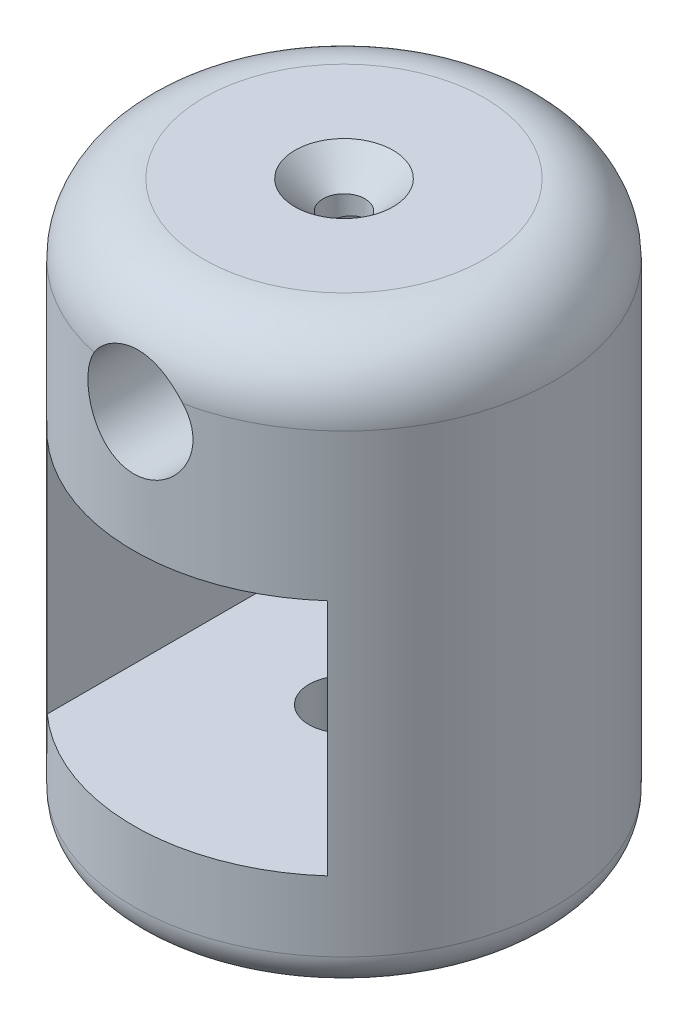
ISO-10303-21;
HEADER;
FILE_DESCRIPTION(('STEP AP214'),'2;1');
FILE_NAME('part.step','',(''),(''),'','','');
FILE_SCHEMA(('AUTOMOTIVE_DESIGN { 1 0 10303 214 1 1 1 1 }'));
ENDSEC;
DATA;
#1=APPLICATION_CONTEXT('core data for automotive mechanical design processes');
#2=APPLICATION_PROTOCOL_DEFINITION('international standard','automotive_design',2000,#1);
#3=PRODUCT_CONTEXT('',#1,'mechanical');
#4=PRODUCT('Part','Part','',(#3));
#5=PRODUCT_RELATED_PRODUCT_CATEGORY('part','',(#4));
#6=PRODUCT_DEFINITION_FORMATION('','',#4);
#7=PRODUCT_DEFINITION_CONTEXT('part definition',#1,'design');
#8=PRODUCT_DEFINITION('design','',#6,#7);
#9=PRODUCT_DEFINITION_SHAPE('','',#8);
#10=(LENGTH_UNIT() NAMED_UNIT(*) SI_UNIT(.MILLI.,.METRE.));
#11=(NAMED_UNIT(*) PLANE_ANGLE_UNIT() SI_UNIT($,.RADIAN.));
#12=(NAMED_UNIT(*) SI_UNIT($,.STERADIAN.) SOLID_ANGLE_UNIT());
#13=UNCERTAINTY_MEASURE_WITH_UNIT(LENGTH_MEASURE(1.E-05),#10,'distance_accuracy_value','');
#14=(GEOMETRIC_REPRESENTATION_CONTEXT(3) GLOBAL_UNCERTAINTY_ASSIGNED_CONTEXT((#13)) GLOBAL_UNIT_ASSIGNED_CONTEXT((#10,
#11,#12)) REPRESENTATION_CONTEXT('',''));
#15=CARTESIAN_POINT('',(0.,0.,0.));
#16=DIRECTION('',(0.,0.,1.));
#17=DIRECTION('',(1.,0.,0.));
#18=AXIS2_PLACEMENT_3D('',#15,#16,#17);
#19=CARTESIAN_POINT('',(0.,40.,0.));
#20=DIRECTION('',(0.,-1.,0.));
#21=DIRECTION('',(0.,0.,-1.));
#22=AXIS2_PLACEMENT_3D('',#19,#20,#21);
#23=CYLINDRICAL_SURFACE('',#22,15.);
#24=CARTESIAN_POINT('',(0.,2.5,0.));
#25=DIRECTION('',(0.,1.,0.));
#26=DIRECTION('',(0.,0.,1.));
#27=AXIS2_PLACEMENT_3D('',#24,#25,#26);
#28=CIRCLE('',#27,15.);
#29=CARTESIAN_POINT('',(0.,2.5,15.));
#30=VERTEX_POINT('',#29);
#31=EDGE_CURVE('E56',#30,#30,#28,.T.);
#32=ORIENTED_EDGE('',*,*,#31,.T.);
#33=EDGE_LOOP('',(#32));
#34=FACE_BOUND('',#33,.T.);
#35=DIRECTION('',(0.,-1.,0.));
#36=VECTOR('',#35,1.);
#37=CARTESIAN_POINT('',(-10.,40.,-11.180339887499));
#38=LINE('',#37,#36);
#39=CARTESIAN_POINT('',(-10.,24.5,-11.180339887499));
#40=VERTEX_POINT('',#39);
#41=CARTESIAN_POINT('',(-10.,7.5,-11.180339887499));
#42=VERTEX_POINT('',#41);
#43=EDGE_CURVE('E101',#40,#42,#38,.T.);
#44=ORIENTED_EDGE('',*,*,#43,.T.);
#45=CARTESIAN_POINT('',(0.,7.5,0.));
#46=DIRECTION('',(0.,-1.,0.));
#47=DIRECTION('',(0.,0.,-1.));
#48=AXIS2_PLACEMENT_3D('',#45,#46,#47);
#49=CIRCLE('',#48,15.);
#50=CARTESIAN_POINT('',(10.,7.5,-11.180339887499));
#51=VERTEX_POINT('',#50);
#52=EDGE_CURVE('E132',#42,#51,#49,.T.);
#53=ORIENTED_EDGE('',*,*,#52,.T.);
#54=DIRECTION('',(0.,-1.,0.));
#55=VECTOR('',#54,1.);
#56=CARTESIAN_POINT('',(10.,40.,-11.180339887499));
#57=LINE('',#56,#55);
#58=CARTESIAN_POINT('',(10.,24.5,-11.1803398874989));
#59=VERTEX_POINT('',#58);
#60=EDGE_CURVE('E128',#51,#59,#57,.F.);
#61=ORIENTED_EDGE('',*,*,#60,.T.);
#62=CARTESIAN_POINT('',(0.,24.5,0.));
#63=DIRECTION('',(0.,1.,0.));
#64=DIRECTION('',(0.,0.,1.));
#65=AXIS2_PLACEMENT_3D('',#62,#63,#64);
#66=CIRCLE('',#65,15.);
#67=EDGE_CURVE('E113',#59,#40,#66,.T.);
#68=ORIENTED_EDGE('',*,*,#67,.T.);
#69=EDGE_LOOP('',(#44,#53,#61,#68));
#70=FACE_BOUND('',#69,.T.);
#71=DIRECTION('',(0.,-1.,0.));
#72=VECTOR('',#71,1.);
#73=CARTESIAN_POINT('',(10.,40.,11.180339887499));
#74=LINE('',#73,#72);
#75=CARTESIAN_POINT('',(10.,24.5,11.1803398874989));
#76=VERTEX_POINT('',#75);
#77=CARTESIAN_POINT('',(10.,7.5,11.180339887499));
#78=VERTEX_POINT('',#77);
#79=EDGE_CURVE('E137',#76,#78,#74,.T.);
#80=ORIENTED_EDGE('',*,*,#79,.T.);
#81=CARTESIAN_POINT('',(-10.,7.5,11.180339887499));
#82=VERTEX_POINT('',#81);
#83=EDGE_CURVE('E114',#78,#82,#49,.T.);
#84=ORIENTED_EDGE('',*,*,#83,.T.);
#85=DIRECTION('',(0.,-1.,0.));
#86=VECTOR('',#85,1.);
#87=CARTESIAN_POINT('',(-10.,40.,11.180339887499));
#88=LINE('',#87,#86);
#89=CARTESIAN_POINT('',(-10.,24.5,11.180339887499));
#90=VERTEX_POINT('',#89);
#91=EDGE_CURVE('E138',#82,#90,#88,.F.);
#92=ORIENTED_EDGE('',*,*,#91,.T.);
#93=EDGE_CURVE('E121',#90,#76,#66,.T.);
#94=ORIENTED_EDGE('',*,*,#93,.T.);
#95=EDGE_LOOP('',(#80,#84,#92,#94));
#96=FACE_BOUND('',#95,.T.);
#97=CARTESIAN_POINT('',(0.,36.75,-15.));
#98=CARTESIAN_POINT('',(0.207190221674328,36.7499941856546,-14.9999964967003));
#99=CARTESIAN_POINT('',(0.414445394576909,36.7327711230655,-14.9956644532957));
#100=CARTESIAN_POINT('',(0.823015809426332,36.6644371217325,-14.9788028457474));
#101=CARTESIAN_POINT('',(1.02432761717685,36.6133069761554,-14.9662686354994));
#102=CARTESIAN_POINT('',(1.41505218045644,36.4789018663448,-14.9343906583008));
#103=CARTESIAN_POINT('',(1.60447890857501,36.3956655032118,-14.9150550710515));
#104=CARTESIAN_POINT('',(1.96668032976107,36.1995465248879,-14.8716335951905));
#105=CARTESIAN_POINT('',(2.13945446087191,36.0866629097026,-14.8475475463539));
#106=CARTESIAN_POINT('',(2.46700481825229,35.8319980258646,-14.7966853397923));
#107=CARTESIAN_POINT('',(2.62138922515264,35.6897210626023,-14.7698676787032));
#108=CARTESIAN_POINT('',(2.9043723180083,35.3813694877274,-14.7168405029484));
#109=CARTESIAN_POINT('',(3.03296809237298,35.2152921926327,-14.6906310572467));
#110=CARTESIAN_POINT('',(3.26256635699744,34.8610119331575,-14.6413693924542));
#111=CARTESIAN_POINT('',(3.36313053981285,34.6725169229782,-14.6183698616203));
#112=CARTESIAN_POINT('',(3.53099227137686,34.2806289708499,-14.5787373704504));
#113=CARTESIAN_POINT('',(3.59829513860035,34.07723841667,-14.5621033923605));
#114=CARTESIAN_POINT('',(3.69638709201191,33.6656412544959,-14.5375119174081));
#115=CARTESIAN_POINT('',(3.72788067083013,33.457612759905,-14.5293872749253));
#116=CARTESIAN_POINT('',(3.75565443766602,33.0390785775016,-14.5222340614898));
#117=CARTESIAN_POINT('',(3.75194035454528,32.8285732982697,-14.5232040106982));
#118=CARTESIAN_POINT('',(3.70996631159927,32.4164604806366,-14.5339801379204));
#119=CARTESIAN_POINT('',(3.67254585047659,32.2147609463367,-14.5435715751823));
#120=CARTESIAN_POINT('',(3.56556046725749,31.8205973727224,-14.5701677417767));
#121=CARTESIAN_POINT('',(3.49599325517349,31.6281339924277,-14.587172999231));
#122=CARTESIAN_POINT('',(3.32597369484297,31.2556549593697,-14.6268778476415));
#123=CARTESIAN_POINT('',(3.2252166680823,31.0757845705261,-14.6496331867454));
#124=CARTESIAN_POINT('',(2.99589069003737,30.735203225608,-14.6982427711498));
#125=CARTESIAN_POINT('',(2.8673168720221,30.5744956298319,-14.7240975583657));
#126=CARTESIAN_POINT('',(2.58165856170305,30.271990960764,-14.7768970134973));
#127=CARTESIAN_POINT('',(2.42386564541465,30.1308637748466,-14.80385173695));
#128=CARTESIAN_POINT('',(2.08652979375925,29.8769468938402,-14.8551491394689));
#129=CARTESIAN_POINT('',(1.90698619426986,29.7641580643411,-14.8794917387352));
#130=CARTESIAN_POINT('',(1.53028972170348,29.569873534439,-14.9229433023548));
#131=CARTESIAN_POINT('',(1.33307848302156,29.4884866493639,-14.9420340031932));
#132=CARTESIAN_POINT('',(0.927190020357209,29.3602067357261,-14.9726979247854));
#133=CARTESIAN_POINT('',(0.718514997876213,29.3133071089547,-14.984272583482));
#134=CARTESIAN_POINT('',(0.301349925975069,29.2563560861029,-14.9983874817844));
#135=CARTESIAN_POINT('',(0.0929917999705268,29.2453924348117,-15.0011513377069));
#136=CARTESIAN_POINT('',(-0.322582187003769,29.2581225051387,-14.9979701203613));
#137=CARTESIAN_POINT('',(-0.529798149111488,29.2818131069978,-14.9920258310463));
#138=CARTESIAN_POINT('',(-0.934035671941224,29.3624272709784,-14.9722395281838));
#139=CARTESIAN_POINT('',(-1.13116279742187,29.4188531586924,-14.9585158546447));
#140=CARTESIAN_POINT('',(-1.51314323113129,29.5627677100711,-14.924717665854));
#141=CARTESIAN_POINT('',(-1.69799529758163,29.650259510783,-14.9046425092496));
#142=CARTESIAN_POINT('',(-2.05380783607457,29.8555903221867,-14.8598326981554));
#143=CARTESIAN_POINT('',(-2.22446360458941,29.9739402809914,-14.8350216841645));
#144=CARTESIAN_POINT('',(-2.54381653410828,30.2369747719929,-14.7836127296943));
#145=CARTESIAN_POINT('',(-2.69250989743313,30.3816638490441,-14.7570144813255));
#146=CARTESIAN_POINT('',(-2.9674764201812,30.6975049021093,-14.7042239239856));
#147=CARTESIAN_POINT('',(-3.09310966905271,30.869219257499,-14.678057604555));
#148=CARTESIAN_POINT('',(-3.31377689753411,31.2318315861713,-14.629821959558));
#149=CARTESIAN_POINT('',(-3.40881223540367,31.4227287074256,-14.6077524521502));
#150=CARTESIAN_POINT('',(-3.56487855151819,31.8172643060161,-14.570452367894));
#151=CARTESIAN_POINT('',(-3.62611099160838,32.0208190707826,-14.5551813805407));
#152=CARTESIAN_POINT('',(-3.71336414985792,32.4357740946363,-14.5331686006952));
#153=CARTESIAN_POINT('',(-3.73939256869197,32.6471726275465,-14.5264249429205));
#154=CARTESIAN_POINT('',(-3.75509647583946,33.0653025596698,-14.5223725301746));
#155=CARTESIAN_POINT('',(-3.74579474444336,33.2719935878592,-14.5247983170337));
#156=CARTESIAN_POINT('',(-3.6934431957724,33.6807597217042,-14.5381977237985));
#157=CARTESIAN_POINT('',(-3.6503940567158,33.8828349200396,-14.5491711719226));
#158=CARTESIAN_POINT('',(-3.53232829861052,34.27552114765,-14.5782815174391));
#159=CARTESIAN_POINT('',(-3.45750351170189,34.4661932630969,-14.5963753810072));
#160=CARTESIAN_POINT('',(-3.27816228401173,34.8324134567878,-14.6376938930212));
#161=CARTESIAN_POINT('',(-3.17364172508521,35.0079594329683,-14.6609192529923));
#162=CARTESIAN_POINT('',(-2.93466937159311,35.343886572504,-14.7106408566155));
#163=CARTESIAN_POINT('',(-2.79950790728071,35.5037526835596,-14.7372066208013));
#164=CARTESIAN_POINT('',(-2.50447342797427,35.7988676119888,-14.7902006811497));
#165=CARTESIAN_POINT('',(-2.34459455315285,35.9341105752825,-14.8166289431745));
#166=CARTESIAN_POINT('',(-2.0011689667565,36.1785282714114,-14.8669413911936));
#167=CARTESIAN_POINT('',(-1.81724605579097,36.2871865341789,-14.8907708341472));
#168=CARTESIAN_POINT('',(-1.43316514877618,36.4718686573514,-14.9326231243774));
#169=CARTESIAN_POINT('',(-1.23301890859185,36.5479159016213,-14.9506501299944));
#170=CARTESIAN_POINT('',(-0.861025633108679,36.6539295758241,-14.9762014891386));
#171=CARTESIAN_POINT('',(-0.690950427270171,36.6898781076336,-14.9850646263173));
#172=CARTESIAN_POINT('',(-0.347265178840707,36.7379148590549,-14.9969651307987));
#173=CARTESIAN_POINT('',(-0.17365540310654,36.7500048732633,-15.0000029362724));
#174=CARTESIAN_POINT('',(0.,36.75,-15.));
#175=B_SPLINE_CURVE_WITH_KNOTS('',3,(#97,#98,#99,#100,#101,#102,#103,#104,#105,#106,#107,#108,
#109,#110,#111,#112,#113,#114,#115,#116,#117,#118,#119,#120,#121,#122,#123,#124,#125,#126,#127,
#128,#129,#130,#131,#132,#133,#134,#135,#136,#137,#138,#139,#140,#141,#142,#143,#144,#145,#146,
#147,#148,#149,#150,#151,#152,#153,#154,#155,#156,#157,#158,#159,#160,#161,#162,#163,#164,#165,
#166,#167,#168,#169,#170,#171,#172,#173,#174),.UNSPECIFIED.,.T.,.F.,(4,2,2,2,2,2,2,2,2,2,2,2,2,
2,2,2,2,2,2,2,2,2,2,2,2,2,2,2,2,2,2,2,2,2,2,2,2,2,4),(0.,0.620934281179725,1.24222059440975,
1.86276225571526,2.48332485042332,3.11536088592847,3.74746823950155,4.38896618864518,
5.03036152923421,5.65890737752674,6.28735095290044,6.90056242525847,7.51381758673398,
8.13326319693,8.75281727098709,9.3900375243085,10.0272772390392,10.6667057253109,
11.3060118422991,11.9289577238149,12.5518475279016,13.165506862934,13.7792281831403,
14.4038396892168,15.0285590752835,15.6686127301949,16.3086379688207,16.9448063654645,
17.5808355814572,18.1985945101388,18.8163410240997,19.430410014185,20.0445642036213,
20.6747394104466,21.3050642444592,21.9468046376885,22.5880840957326,23.1085560737525,
23.6289889012748),.UNSPECIFIED.);
#176=CARTESIAN_POINT('',(3.17214438511239,35.,-14.6607469113957));
#177=VERTEX_POINT('',#176);
#178=CARTESIAN_POINT('',(-3.17214438511238,35.,-14.6607469113957));
#179=VERTEX_POINT('',#178);
#180=EDGE_CURVE('E142',#177,#179,#175,.T.);
#181=ORIENTED_EDGE('',*,*,#180,.F.);
#182=CARTESIAN_POINT('',(0.,35.,0.));
#183=DIRECTION('',(0.,1.,0.));
#184=DIRECTION('',(0.,0.,1.));
#185=AXIS2_PLACEMENT_3D('',#182,#183,#184);
#186=CIRCLE('',#185,15.);
#187=CARTESIAN_POINT('',(3.17214438511238,35.,14.6607469113957));
#188=VERTEX_POINT('',#187);
#189=EDGE_CURVE('E190',#177,#188,#186,.F.);
#190=ORIENTED_EDGE('',*,*,#189,.T.);
#191=CARTESIAN_POINT('',(-3.75,33.,14.5236875482778));
#192=CARTESIAN_POINT('',(-3.74999411788961,32.7929238736101,14.5236915013179));
#193=CARTESIAN_POINT('',(-3.73278936824648,32.5857826519822,14.528164590219));
#194=CARTESIAN_POINT('',(-3.66453468819569,32.1774486327397,14.5455279298885));
#195=CARTESIAN_POINT('',(-3.61346506011316,31.9762593682977,14.5584230793244));
#196=CARTESIAN_POINT('',(-3.47923679944806,31.5857946927192,14.5910808689423));
#197=CARTESIAN_POINT('',(-3.39611959178174,31.3965042669214,14.6108346403569));
#198=CARTESIAN_POINT('',(-3.20028171189208,31.0345337211902,14.6549728804314));
#199=CARTESIAN_POINT('',(-3.08755978284103,30.8618543068797,14.6793575456773));
#200=CARTESIAN_POINT('',(-2.83306264096782,30.5342075321067,14.7306107453344));
#201=CARTESIAN_POINT('',(-2.69075533155608,30.3796595994749,14.7575189643455));
#202=CARTESIAN_POINT('',(-2.382273096151,30.0963579084595,14.8104431327294));
#203=CARTESIAN_POINT('',(-2.21609594127046,29.9676065615674,14.8364589984958));
#204=CARTESIAN_POINT('',(-1.86171780161844,29.7378367985531,14.8851062328087));
#205=CARTESIAN_POINT('',(-1.67324186429268,29.6372304177578,14.9076853110089));
#206=CARTESIAN_POINT('',(-1.28139477643915,29.4692855337704,14.9464621788898));
#207=CARTESIAN_POINT('',(-1.07802582868791,29.4019421221267,14.9626609100152));
#208=CARTESIAN_POINT('',(-0.666538138131245,29.3037782481321,14.9865713827227));
#209=CARTESIAN_POINT('',(-0.458599079323466,29.2722455335101,14.9944484076647));
#210=CARTESIAN_POINT('',(-0.040243228894155,29.2443624310867,15.0014039116095));
#211=CARTESIAN_POINT('',(0.170173191807105,29.2480068416856,15.0004836914507));
#212=CARTESIAN_POINT('',(0.582570926896446,29.2898622753752,14.9900714243029));
#213=CARTESIAN_POINT('',(0.784635808503985,29.3273044875808,14.9807700351127));
#214=CARTESIAN_POINT('',(1.17951842780134,29.4344569050728,14.9548625478733));
#215=CARTESIAN_POINT('',(1.37233567263919,29.5041688280662,14.9382560609783));
#216=CARTESIAN_POINT('',(1.74527513813172,29.6745038560305,14.8993126455118));
#217=CARTESIAN_POINT('',(1.92526691162419,29.7754005669922,14.8769252954196));
#218=CARTESIAN_POINT('',(2.26603358377704,30.0050335186748,14.828848557151));
#219=CARTESIAN_POINT('',(2.4268051315714,30.1337746028425,14.8031585948106));
#220=CARTESIAN_POINT('',(2.72915263156781,30.4195631129719,14.7504557065189));
#221=CARTESIAN_POINT('',(2.87009129652906,30.5772823385155,14.7234257927984));
#222=CARTESIAN_POINT('',(3.12366140986426,30.9143999603165,14.671725652841));
#223=CARTESIAN_POINT('',(3.23629153518354,31.0937993692594,14.6470555369272));
#224=CARTESIAN_POINT('',(3.43045548382641,31.4704350512057,14.6028074521348));
#225=CARTESIAN_POINT('',(3.51183587610259,31.6677535953946,14.5832547546155));
#226=CARTESIAN_POINT('',(3.64007107734905,32.0738782020376,14.5517796010927));
#227=CARTESIAN_POINT('',(3.68693327456397,32.2826817959531,14.5398555123401));
#228=CARTESIAN_POINT('',(3.74374445800775,32.6999392523115,14.5253303404051));
#229=CARTESIAN_POINT('',(3.75463571088105,32.908256690016,14.5224913347325));
#230=CARTESIAN_POINT('',(3.74177548577037,33.3237329048734,14.5258101503919));
#231=CARTESIAN_POINT('',(3.71802719677408,33.530891786923,14.5319671435336));
#232=CARTESIAN_POINT('',(3.637388195908,33.934671397424,14.5523562297952));
#233=CARTESIAN_POINT('',(3.58104610242303,34.1314090898541,14.5664545536435));
#234=CARTESIAN_POINT('',(3.43742712250553,34.5126471867797,14.6010107739366));
#235=CARTESIAN_POINT('',(3.35014657156871,34.6971461385836,14.6214694236946));
#236=CARTESIAN_POINT('',(3.14515600190495,35.0526619168004,14.6669420564342));
#237=CARTESIAN_POINT('',(3.02688263075348,35.2233432600645,14.6920375291091));
#238=CARTESIAN_POINT('',(2.76397609850418,35.5427825442022,14.7437562460663));
#239=CARTESIAN_POINT('',(2.61933860552039,35.6915368749751,14.7703797409245));
#240=CARTESIAN_POINT('',(2.30348520369273,35.9667165638564,14.8229610454767));
#241=CARTESIAN_POINT('',(2.13169482199348,36.0924900938232,14.8488855309282));
#242=CARTESIAN_POINT('',(1.76888506010503,36.3134038004269,14.8964582492053));
#243=CARTESIAN_POINT('',(1.57786668359097,36.4085455749123,14.9181067050592));
#244=CARTESIAN_POINT('',(1.18334325649159,36.5646690517919,14.9545517360749));
#245=CARTESIAN_POINT('',(0.979940178854562,36.6258964265686,14.9693974503361));
#246=CARTESIAN_POINT('',(0.56531160119553,36.7131905019126,14.9907794009368));
#247=CARTESIAN_POINT('',(0.354087618904657,36.7392639881086,14.9973172409013));
#248=CARTESIAN_POINT('',(-0.0640632241624573,36.7551284609083,15.0012813528302));
#249=CARTESIAN_POINT('',(-0.270951851122577,36.7458814091078,14.9989492079996));
#250=CARTESIAN_POINT('',(-0.680128111555312,36.6935706476462,14.9859711171541));
#251=CARTESIAN_POINT('',(-0.88241588167848,36.6505079437006,14.9753254183938));
#252=CARTESIAN_POINT('',(-1.2756413836679,36.5323041758593,14.9469537320208));
#253=CARTESIAN_POINT('',(-1.46663435467823,36.4573370500711,14.9292661688397));
#254=CARTESIAN_POINT('',(-1.83343894890609,36.2776103286766,14.8886733342622));
#255=CARTESIAN_POINT('',(-2.00924865474612,36.1728469774857,14.8657674052034));
#256=CARTESIAN_POINT('',(-2.34525723158738,35.9335678725145,14.8165218630108));
#257=CARTESIAN_POINT('',(-2.50498120611875,35.7983994641106,14.7901131353124));
#258=CARTESIAN_POINT('',(-2.79980632602564,35.503414305085,14.7371493396446));
#259=CARTESIAN_POINT('',(-2.93490121903721,35.3435913145831,14.7105942362738));
#260=CARTESIAN_POINT('',(-3.17910759926936,35.0002446967895,14.6597803442063));
#261=CARTESIAN_POINT('',(-3.28768732281142,34.8163345373803,14.6355736377483));
#262=CARTESIAN_POINT('',(-3.47222586219551,34.4322919129694,14.592898331056));
#263=CARTESIAN_POINT('',(-3.54820841157057,34.2321713771481,14.5744255587455));
#264=CARTESIAN_POINT('',(-3.65408448214126,33.8603362056182,14.5481965781526));
#265=CARTESIAN_POINT('',(-3.68997438973829,33.690400633552,14.5390748626312));
#266=CARTESIAN_POINT('',(-3.73793359714413,33.3469917412587,14.5268189468483));
#267=CARTESIAN_POINT('',(-3.75000492889406,33.1735187240835,14.5236842358415));
#268=CARTESIAN_POINT('',(-3.75,33.,14.5236875482778));
#269=B_SPLINE_CURVE_WITH_KNOTS('',3,(#191,#192,#193,#194,#195,#196,#197,#198,#199,#200,#201,
#202,#203,#204,#205,#206,#207,#208,#209,#210,#211,#212,#213,#214,#215,#216,#217,#218,#219,#220,
#221,#222,#223,#224,#225,#226,#227,#228,#229,#230,#231,#232,#233,#234,#235,#236,#237,#238,#239,
#240,#241,#242,#243,#244,#245,#246,#247,#248,#249,#250,#251,#252,#253,#254,#255,#256,#257,#258,
#259,#260,#261,#262,#263,#264,#265,#266,#267,#268),.UNSPECIFIED.,.T.,.F.,(4,2,2,2,2,2,2,2,2,2,2,
2,2,2,2,2,2,2,2,2,2,2,2,2,2,2,2,2,2,2,2,2,2,2,2,2,2,2,4),(0.,0.620591162604203,1.241543612143,
1.86169609074903,2.48187490133218,3.11435931289464,3.746902822198,4.38827244596879,
5.02954739770638,5.65783126493019,6.2860222299903,6.9002739403342,7.51455835087179,
8.13439311381667,8.7543357820337,9.39105699857868,10.027807967997,10.6676464801437,
11.3073480019813,11.9301536215011,12.5529019078693,13.1654610752503,13.7780928214335,
14.4027426879996,15.0274952833879,15.667879964592,16.3082312359055,16.9438810922162,
17.5794082337478,18.1977516920241,18.8160767607669,19.4310731485079,20.0461470861833,
20.6759564488433,21.3059254735949,21.947647159405,22.5889008206633,23.1089674078239,
23.6289896266568),.UNSPECIFIED.);
#270=CARTESIAN_POINT('',(-3.17214438511246,35.,14.6607469113957));
#271=VERTEX_POINT('',#270);
#272=EDGE_CURVE('E145',#271,#188,#269,.T.);
#273=ORIENTED_EDGE('',*,*,#272,.F.);
#274=CARTESIAN_POINT('',(0.,35.,0.));
#275=DIRECTION('',(0.,1.,0.));
#276=DIRECTION('',(0.,0.,1.));
#277=AXIS2_PLACEMENT_3D('',#274,#275,#276);
#278=CIRCLE('',#277,15.);
#279=EDGE_CURVE('E63',#271,#179,#278,.F.);
#280=ORIENTED_EDGE('',*,*,#279,.T.);
#281=EDGE_LOOP('',(#181,#190,#273,#280));
#282=FACE_BOUND('',#281,.T.);
#283=ADVANCED_FACE('F47',(#34,#70,#96,#282),#23,.T.);
#284=CARTESIAN_POINT('',(0.,40.,0.));
#285=DIRECTION('',(0.,1.,0.));
#286=DIRECTION('',(0.,0.,1.));
#287=AXIS2_PLACEMENT_3D('',#284,#285,#286);
#288=PLANE('',#287);
#289=CARTESIAN_POINT('',(0.,40.,0.));
#290=DIRECTION('',(0.,1.,0.));
#291=DIRECTION('',(0.,0.,1.));
#292=AXIS2_PLACEMENT_3D('',#289,#290,#291);
#293=CIRCLE('',#292,3.50000000000004);
#294=CARTESIAN_POINT('',(0.,40.,3.50000000000004));
#295=VERTEX_POINT('',#294);
#296=EDGE_CURVE('E227',#295,#295,#293,.F.);
#297=ORIENTED_EDGE('',*,*,#296,.T.);
#298=EDGE_LOOP('',(#297));
#299=FACE_BOUND('',#298,.T.);
#300=CARTESIAN_POINT('',(0.,40.,0.));
#301=DIRECTION('',(0.,1.,0.));
#302=DIRECTION('',(0.,0.,1.));
#303=AXIS2_PLACEMENT_3D('',#300,#301,#302);
#304=CIRCLE('',#303,10.);
#305=CARTESIAN_POINT('',(0.,40.,10.));
#306=VERTEX_POINT('',#305);
#307=EDGE_CURVE('E245',#306,#306,#304,.T.);
#308=ORIENTED_EDGE('',*,*,#307,.T.);
#309=EDGE_LOOP('',(#308));
#310=FACE_BOUND('',#309,.T.);
#311=ADVANCED_FACE('F169',(#299,#310),#288,.T.);
#312=CARTESIAN_POINT('',(0.,0.,0.));
#313=DIRECTION('',(0.,1.,0.));
#314=DIRECTION('',(0.,0.,1.));
#315=AXIS2_PLACEMENT_3D('',#312,#313,#314);
#316=PLANE('',#315);
#317=CARTESIAN_POINT('',(0.,0.,0.));
#318=DIRECTION('',(0.,1.,0.));
#319=DIRECTION('',(0.,0.,1.));
#320=AXIS2_PLACEMENT_3D('',#317,#318,#319);
#321=CIRCLE('',#320,12.5);
#322=CARTESIAN_POINT('',(0.,0.,12.5));
#323=VERTEX_POINT('',#322);
#324=EDGE_CURVE('E11',#323,#323,#321,.F.);
#325=ORIENTED_EDGE('',*,*,#324,.T.);
#326=EDGE_LOOP('',(#325));
#327=FACE_BOUND('',#326,.T.);
#328=CARTESIAN_POINT('',(0.,0.,0.));
#329=DIRECTION('',(0.,-1.,0.));
#330=DIRECTION('',(0.,0.,-1.));
#331=AXIS2_PLACEMENT_3D('',#328,#329,#330);
#332=CIRCLE('',#331,2.5);
#333=CARTESIAN_POINT('',(0.,0.,-2.5));
#334=VERTEX_POINT('',#333);
#335=EDGE_CURVE('E253',#334,#334,#332,.T.);
#336=ORIENTED_EDGE('',*,*,#335,.F.);
#337=EDGE_LOOP('',(#336));
#338=FACE_BOUND('',#337,.T.);
#339=ADVANCED_FACE('F166',(#327,#338),#316,.F.);
#340=CARTESIAN_POINT('',(0.,33.,40.));
#341=DIRECTION('',(0.,0.,-1.));
#342=DIRECTION('',(-1.,0.,0.));
#343=AXIS2_PLACEMENT_3D('',#340,#341,#342);
#344=CYLINDRICAL_SURFACE('',#343,3.75);
#345=CARTESIAN_POINT('',(0.,36.75,1.5));
#346=CARTESIAN_POINT('',(-0.0806197540821685,36.7499945342031,1.49999261113221));
#347=CARTESIAN_POINT('',(-0.161379423068005,36.747369707302,1.49346168593372));
#348=CARTESIAN_POINT('',(-0.320622360313422,36.7371258982548,1.46756422235907));
#349=CARTESIAN_POINT('',(-0.399098833170936,36.7294933402416,1.4481627906854));
#350=CARTESIAN_POINT('',(-0.551215442045553,36.7100565690984,1.39734294145588));
#351=CARTESIAN_POINT('',(-0.624870496212719,36.6982660227305,1.36596386533745));
#352=CARTESIAN_POINT('',(-0.765803977746276,36.6716745809706,1.29223562000509));
#353=CARTESIAN_POINT('',(-0.833084607563244,36.6568747309354,1.2498902588108));
#354=CARTESIAN_POINT('',(-0.962625755677795,36.6249816462781,1.1533233760793));
#355=CARTESIAN_POINT('',(-1.02454670441266,36.6078172269689,1.0986700078198));
#356=CARTESIAN_POINT('',(-1.13863125358854,36.5734543267965,0.979949997392417));
#357=CARTESIAN_POINT('',(-1.19079008035015,36.5562558334034,0.915878777091194));
#358=CARTESIAN_POINT('',(-1.28615592546966,36.5229209384785,0.776678947318301));
#359=CARTESIAN_POINT('',(-1.3288612358966,36.5068658697371,0.701185135482602));
#360=CARTESIAN_POINT('',(-1.40081603927786,36.4787523539009,0.543347701184969));
#361=CARTESIAN_POINT('',(-1.43007192321438,36.4666920093313,0.46100735411373));
#362=CARTESIAN_POINT('',(-1.4729241175469,36.4486976824561,0.295715749805923));
#363=CARTESIAN_POINT('',(-1.48717047435424,36.442510652667,0.21296157331784));
#364=CARTESIAN_POINT('',(-1.50162972123002,36.4362300303686,0.0460237512695493));
#365=CARTESIAN_POINT('',(-1.50184951223492,36.4361334414208,-0.0381591709687612));
#366=CARTESIAN_POINT('',(-1.48874202562841,36.4418287521,-0.199317503593533));
#367=CARTESIAN_POINT('',(-1.47635648572885,36.4472113127884,-0.276386785806774));
#368=CARTESIAN_POINT('',(-1.43996016022336,36.4625714070588,-0.427244667005036));
#369=CARTESIAN_POINT('',(-1.41594734610347,36.4725497424126,-0.501032691082732));
#370=CARTESIAN_POINT('',(-1.3565210494133,36.496196138164,-0.645013377147032));
#371=CARTESIAN_POINT('',(-1.32088489673649,36.5099353446059,-0.715101929291019));
#372=CARTESIAN_POINT('',(-1.23937984554916,36.5395358729242,-0.848561862271175));
#373=CARTESIAN_POINT('',(-1.19350710382563,36.5553979909264,-0.911930707052106));
#374=CARTESIAN_POINT('',(-1.08866294959082,36.588950525567,-1.0353072966015));
#375=CARTESIAN_POINT('',(-1.02895309722798,36.6066874873211,-1.09467654708451));
#376=CARTESIAN_POINT('',(-0.900235820572644,36.6409486871871,-1.20276335850153));
#377=CARTESIAN_POINT('',(-0.831226549000824,36.6574726833399,-1.25147879805772));
#378=CARTESIAN_POINT('',(-0.684058239454381,36.6878601094841,-1.33771308556188));
#379=CARTESIAN_POINT('',(-0.605745368509857,36.7016645257156,-1.37499171089779));
#380=CARTESIAN_POINT('',(-0.44326782411216,36.7246112124657,-1.43562589580854));
#381=CARTESIAN_POINT('',(-0.359106147637254,36.7337558509679,-1.45898852816806));
#382=CARTESIAN_POINT('',(-0.192671915705864,36.7459210463018,-1.48983622156478));
#383=CARTESIAN_POINT('',(-0.11058247048915,36.7492720937514,-1.49817934069017));
#384=CARTESIAN_POINT('',(0.0538839823558643,36.7505135888297,-1.50128482539646));
#385=CARTESIAN_POINT('',(0.136260909917944,36.7484054518672,-1.49605071116063));
#386=CARTESIAN_POINT('',(0.295074554341492,36.7391817529782,-1.47278118558601));
#387=CARTESIAN_POINT('',(0.371611868831607,36.7322954350914,-1.45533151473677));
#388=CARTESIAN_POINT('',(0.520601571045586,36.7144458105412,-1.40892321876764));
#389=CARTESIAN_POINT('',(0.593053432668634,36.703481980174,-1.37996311524849));
#390=CARTESIAN_POINT('',(0.734309089362527,36.6781244607811,-1.31041129524004));
#391=CARTESIAN_POINT('',(0.802933517066555,36.6636361198485,-1.26949089596764));
#392=CARTESIAN_POINT('',(0.932582693434918,36.6328002355914,-1.17754475707077));
#393=CARTESIAN_POINT('',(0.993604380570846,36.616451948327,-1.12651496780804));
#394=CARTESIAN_POINT('',(1.11054228227162,36.5823383822858,-1.01184749028778));
#395=CARTESIAN_POINT('',(1.16585545035455,36.5645508106879,-0.947599843870342));
#396=CARTESIAN_POINT('',(1.26506339806028,36.5305625468785,-0.810419937742973));
#397=CARTESIAN_POINT('',(1.30895629600313,36.5143621164488,-0.737486249745037));
#398=CARTESIAN_POINT('',(1.38435562644872,36.4853572493078,-0.58390372905442));
#399=CARTESIAN_POINT('',(1.41573794590084,36.4725872316359,-0.503187000590766));
#400=CARTESIAN_POINT('',(1.46422216477898,36.4524275510845,-0.336949761213632));
#401=CARTESIAN_POINT('',(1.48133460395199,36.44503391772,-0.25143284564068));
#402=CARTESIAN_POINT('',(1.4997867129588,36.4370381947494,-0.0846540736690916));
#403=CARTESIAN_POINT('',(1.50217281172715,36.4359856575613,-0.00352887030498538));
#404=CARTESIAN_POINT('',(1.49385236945814,36.4396112702482,0.157908643284971));
#405=CARTESIAN_POINT('',(1.48314749093534,36.444288692436,0.238221055426939));
#406=CARTESIAN_POINT('',(1.44980352461524,36.4584498680927,0.392499142391283));
#407=CARTESIAN_POINT('',(1.42765312017823,36.4677362387059,0.46659020582475));
#408=CARTESIAN_POINT('',(1.37250408636826,36.4899300092452,0.610033972210113));
#409=CARTESIAN_POINT('',(1.33950246104536,36.502838409045,0.679385360174871));
#410=CARTESIAN_POINT('',(1.2614045720698,36.5317395720337,0.815707214453084));
#411=CARTESIAN_POINT('',(1.21572400136962,36.5478666173493,0.882314002597864));
#412=CARTESIAN_POINT('',(1.11441908945362,36.5809785327918,1.00724498790282));
#413=CARTESIAN_POINT('',(1.05879175111359,36.597963660363,1.06556667909624));
#414=CARTESIAN_POINT('',(0.934879129704345,36.6322017531555,1.17615213994771));
#415=CARTESIAN_POINT('',(0.866007000859602,36.6494006847164,1.22777798017355));
#416=CARTESIAN_POINT('',(0.719925240214333,36.6810030503529,1.31875278196623));
#417=CARTESIAN_POINT('',(0.642711753410427,36.6954051831968,1.3580960341144));
#418=CARTESIAN_POINT('',(0.4835535468714,36.719547861119,1.42246666139272));
#419=CARTESIAN_POINT('',(0.40172371366477,36.7293702229127,1.44774699267025));
#420=CARTESIAN_POINT('',(0.234657409710913,36.7435822965702,1.4839793407157));
#421=CARTESIAN_POINT('',(0.149432644394183,36.7479892462173,1.49497682755792));
#422=CARTESIAN_POINT('',(0.0426842234181961,36.749819246281,1.49954653573371));
#423=CARTESIAN_POINT('',(0.0213470165555682,36.7500014472688,1.5000019564719));
#424=CARTESIAN_POINT('',(0.,36.75,1.5));
#425=B_SPLINE_CURVE_WITH_KNOTS('',3,(#345,#346,#347,#348,#349,#350,#351,#352,#353,#354,#355,
#356,#357,#358,#359,#360,#361,#362,#363,#364,#365,#366,#367,#368,#369,#370,#371,#372,#373,#374,
#375,#376,#377,#378,#379,#380,#381,#382,#383,#384,#385,#386,#387,#388,#389,#390,#391,#392,#393,
#394,#395,#396,#397,#398,#399,#400,#401,#402,#403,#404,#405,#406,#407,#408,#409,#410,#411,#412,
#413,#414,#415,#416,#417,#418,#419,#420,#421,#422,#423,#424),.UNSPECIFIED.,.T.,.F.,(4,2,2,2,2,2,
2,2,2,2,2,2,2,2,2,2,2,2,2,2,2,2,2,2,2,2,2,2,2,2,2,2,2,2,2,2,2,2,2,4),(0.,0.241802240919803,
0.484262727005951,0.725933593103687,0.967520651759881,1.21948036275298,1.47156296200809,
1.73486444114413,1.99804067338701,2.24928078981621,2.50039729755366,2.73403746301029,
2.96771840442036,3.20616844724112,3.44470816453638,3.70168761889918,3.958718196298,
4.22082684872105,4.48280217085343,4.72926888396006,4.97567170177562,5.21100341673274,
5.44636536745347,5.68892635048697,5.93158469624227,6.19026355968311,6.44898501782811,
6.71021283855621,6.9712475448445,7.21349755044561,7.45571679422284,7.68835738911577,
7.92106226853871,8.16709101042519,8.41319401011295,8.67525317650377,8.937433977304,
9.19473225759989,9.45120939303257,9.51523534422597),.UNSPECIFIED.);
#426=CARTESIAN_POINT('',(0.,36.75,1.5));
#427=VERTEX_POINT('',#426);
#428=EDGE_CURVE('E176',#427,#427,#425,.T.);
#429=ORIENTED_EDGE('',*,*,#428,.F.);
#430=EDGE_LOOP('',(#429));
#431=FACE_BOUND('',#430,.T.);
#432=ORIENTED_EDGE('',*,*,#272,.T.);
#433=CARTESIAN_POINT('',(3.17214438511238,35.,14.6607469113957));
#434=CARTESIAN_POINT('',(3.11799735854917,35.0859117576986,14.6724738407767));
#435=CARTESIAN_POINT('',(3.06023017061859,35.1697700274126,14.6823826531165));
#436=CARTESIAN_POINT('',(2.93792495562733,35.3326887570001,14.6989791536758));
#437=CARTESIAN_POINT('',(2.87338933703029,35.4117509078136,14.7056679829829));
#438=CARTESIAN_POINT('',(2.73814288593122,35.5642621700175,14.7162344464858));
#439=CARTESIAN_POINT('',(2.66744750330506,35.6377245050174,14.7201188993766));
#440=CARTESIAN_POINT('',(2.52028445767782,35.7786799391455,14.7255684556452));
#441=CARTESIAN_POINT('',(2.44381644141061,35.846172672404,14.7271334169566));
#442=CARTESIAN_POINT('',(2.20665728460236,36.0388371369394,14.7290697584359));
#443=CARTESIAN_POINT('',(2.03799078336068,36.1544431233599,14.7266964883255));
#444=CARTESIAN_POINT('',(1.6842495728041,36.3566955477808,14.7185430412923));
#445=CARTESIAN_POINT('',(1.49916864663474,36.4433309535917,14.7127615688137));
#446=CARTESIAN_POINT('',(1.11195660733811,36.5874624475894,14.701223075386));
#447=CARTESIAN_POINT('',(0.909491455366617,36.6440658108807,14.6954713632829));
#448=CARTESIAN_POINT('',(0.497891244861056,36.7227024042465,14.6870447055341));
#449=CARTESIAN_POINT('',(0.288756070991909,36.7447350362081,14.6843698131211));
#450=CARTESIAN_POINT('',(-0.131024119041662,36.7536061912092,14.6833232184391));
#451=CARTESIAN_POINT('',(-0.341671859969688,36.7403187173344,14.6849669215928));
#452=CARTESIAN_POINT('',(-0.757707183971354,36.6786681216945,14.6918372360213));
#453=CARTESIAN_POINT('',(-0.963094704928436,36.630304585923,14.6970638895859));
#454=CARTESIAN_POINT('',(-1.36257006247628,36.500002797134,14.7085419940283));
#455=CARTESIAN_POINT('',(-1.55667191886694,36.4181072634834,14.7147921349381));
#456=CARTESIAN_POINT('',(-1.9285733476454,36.2229066242047,14.7245706357529));
#457=CARTESIAN_POINT('',(-2.10637545196833,36.1096064078873,14.7280994190155));
#458=CARTESIAN_POINT('',(-2.36207190336133,35.9147241799539,14.7281499078719));
#459=CARTESIAN_POINT('',(-2.44775733036259,35.8431390091684,14.7271793069597));
#460=CARTESIAN_POINT('',(-2.61239781238374,35.6926382562131,14.7226228373426));
#461=CARTESIAN_POINT('',(-2.6913529883165,35.6137228057892,14.7190370156327));
#462=CARTESIAN_POINT('',(-2.8420589742529,35.4490187568802,14.708614589786));
#463=CARTESIAN_POINT('',(-2.91378578649947,35.3632088607162,14.7017675632354));
#464=CARTESIAN_POINT('',(-3.0491750620589,35.1857578306016,14.6842588771263));
#465=CARTESIAN_POINT('',(-3.1128341724818,35.0941142958394,14.6735956385663));
#466=CARTESIAN_POINT('',(-3.17214438511238,35.,14.6607469113957));
#467=B_SPLINE_CURVE_WITH_KNOTS('',3,(#433,#434,#435,#436,#437,#438,#439,#440,#441,#442,#443,
#444,#445,#446,#447,#448,#449,#450,#451,#452,#453,#454,#455,#456,#457,#458,#459,#460,#461,#462,
#463,#464,#465,#466),.UNSPECIFIED.,.F.,.F.,(4,2,2,2,2,2,2,2,2,2,2,2,2,2,2,2,4),(0.,
0.3065542001402,0.612999684443986,0.918697529841745,1.22441409812879,1.83486376851128,
2.44554563815594,3.07348642442033,3.70143807465359,4.33163281150226,4.96183498672717,
5.5912367776916,6.22054063376784,6.55511455865028,6.88968247145031,7.22532687132605,
7.56111030879077),.UNSPECIFIED.);
#468=EDGE_CURVE('E189',#188,#271,#467,.T.);
#469=ORIENTED_EDGE('',*,*,#468,.T.);
#470=EDGE_LOOP('',(#432,#469));
#471=FACE_BOUND('',#470,.T.);
#472=ORIENTED_EDGE('',*,*,#180,.T.);
#473=CARTESIAN_POINT('',(-3.17214438511238,35.,-14.6607469113957));
#474=CARTESIAN_POINT('',(-3.11799735854916,35.0859117576986,-14.6724738407767));
#475=CARTESIAN_POINT('',(-3.06023017061859,35.1697700274126,-14.6823826531165));
#476=CARTESIAN_POINT('',(-2.93792495562733,35.3326887570001,-14.6989791536758));
#477=CARTESIAN_POINT('',(-2.87338933703029,35.4117509078136,-14.7056679829829));
#478=CARTESIAN_POINT('',(-2.73814288593122,35.5642621700175,-14.7162344464858));
#479=CARTESIAN_POINT('',(-2.66744750330505,35.6377245050174,-14.7201188993766));
#480=CARTESIAN_POINT('',(-2.52028445767782,35.7786799391455,-14.7255684556452));
#481=CARTESIAN_POINT('',(-2.4438164414106,35.846172672404,-14.7271334169566));
#482=CARTESIAN_POINT('',(-2.20665728460235,36.0388371369394,-14.7290697584359));
#483=CARTESIAN_POINT('',(-2.03799078336068,36.1544431233599,-14.7266964883255));
#484=CARTESIAN_POINT('',(-1.68424957280409,36.3566955477808,-14.7185430412923));
#485=CARTESIAN_POINT('',(-1.49916864663473,36.4433309535917,-14.7127615688137));
#486=CARTESIAN_POINT('',(-1.11195660733811,36.5874624475894,-14.701223075386));
#487=CARTESIAN_POINT('',(-0.909491455366615,36.6440658108807,-14.6954713632829));
#488=CARTESIAN_POINT('',(-0.497891244861054,36.7227024042465,-14.6870447055341));
#489=CARTESIAN_POINT('',(-0.288756070991907,36.7447350362081,-14.6843698131211));
#490=CARTESIAN_POINT('',(0.131024119041665,36.7536061912092,-14.6833232184391));
#491=CARTESIAN_POINT('',(0.341671859969692,36.7403187173344,-14.6849669215928));
#492=CARTESIAN_POINT('',(0.757707183971357,36.6786681216945,-14.6918372360213));
#493=CARTESIAN_POINT('',(0.963094704928439,36.630304585923,-14.6970638895859));
#494=CARTESIAN_POINT('',(1.36257006247628,36.500002797134,-14.7085419940283));
#495=CARTESIAN_POINT('',(1.55667191886694,36.4181072634834,-14.7147921349381));
#496=CARTESIAN_POINT('',(1.9285733476454,36.2229066242047,-14.7245706357529));
#497=CARTESIAN_POINT('',(2.10637545196833,36.1096064078873,-14.7280994190155));
#498=CARTESIAN_POINT('',(2.36207190336134,35.9147241799539,-14.7281499078719));
#499=CARTESIAN_POINT('',(2.4477573303626,35.8431390091684,-14.7271793069597));
#500=CARTESIAN_POINT('',(2.61239781238374,35.6926382562131,-14.7226228373426));
#501=CARTESIAN_POINT('',(2.6913529883165,35.6137228057892,-14.7190370156327));
#502=CARTESIAN_POINT('',(2.84205897425291,35.4490187568802,-14.708614589786));
#503=CARTESIAN_POINT('',(2.91378578649947,35.3632088607162,-14.7017675632354));
#504=CARTESIAN_POINT('',(3.0491750620589,35.1857578306016,-14.6842588771263));
#505=CARTESIAN_POINT('',(3.1128341724818,35.0941142958394,-14.6735956385663));
#506=CARTESIAN_POINT('',(3.17214438511238,35.,-14.6607469113957));
#507=B_SPLINE_CURVE_WITH_KNOTS('',3,(#473,#474,#475,#476,#477,#478,#479,#480,#481,#482,#483,
#484,#485,#486,#487,#488,#489,#490,#491,#492,#493,#494,#495,#496,#497,#498,#499,#500,#501,#502,
#503,#504,#505,#506),.UNSPECIFIED.,.F.,.F.,(4,2,2,2,2,2,2,2,2,2,2,2,2,2,2,2,4),(0.,
0.3065542001402,0.612999684443986,0.918697529841745,1.22441409812879,1.83486376851128,
2.44554563815594,3.07348642442033,3.70143807465359,4.33163281150226,4.96183498672717,
5.5912367776916,6.22054063376785,6.55511455865028,6.88968247145031,7.22532687132605,
7.56111030879077),.UNSPECIFIED.);
#508=EDGE_CURVE('E69',#179,#177,#507,.T.);
#509=ORIENTED_EDGE('',*,*,#508,.T.);
#510=EDGE_LOOP('',(#472,#509));
#511=FACE_BOUND('',#510,.T.);
#512=ADVANCED_FACE('F160',(#431,#471,#511),#344,.F.);
#513=CARTESIAN_POINT('',(0.,7.5,40.));
#514=DIRECTION('',(0.,-1.,0.));
#515=DIRECTION('',(0.,0.,-1.));
#516=AXIS2_PLACEMENT_3D('',#513,#514,#515);
#517=PLANE('',#516);
#518=CARTESIAN_POINT('',(0.,7.5,0.));
#519=DIRECTION('',(0.,-1.,0.));
#520=DIRECTION('',(0.,0.,-1.));
#521=AXIS2_PLACEMENT_3D('',#518,#519,#520);
#522=CIRCLE('',#521,2.5);
#523=CARTESIAN_POINT('',(0.,7.5,-2.5));
#524=VERTEX_POINT('',#523);
#525=EDGE_CURVE('E250',#524,#524,#522,.T.);
#526=ORIENTED_EDGE('',*,*,#525,.T.);
#527=EDGE_LOOP('',(#526));
#528=FACE_BOUND('',#527,.T.);
#529=DIRECTION('',(0.,0.,-1.));
#530=VECTOR('',#529,1.);
#531=CARTESIAN_POINT('',(10.,7.5,40.));
#532=LINE('',#531,#530);
#533=EDGE_CURVE('E242',#78,#51,#532,.T.);
#534=ORIENTED_EDGE('',*,*,#533,.T.);
#535=ORIENTED_EDGE('',*,*,#52,.F.);
#536=DIRECTION('',(0.,0.,-1.));
#537=VECTOR('',#536,1.);
#538=CARTESIAN_POINT('',(-10.,7.5,40.));
#539=LINE('',#538,#537);
#540=EDGE_CURVE('E107',#82,#42,#539,.T.);
#541=ORIENTED_EDGE('',*,*,#540,.F.);
#542=ORIENTED_EDGE('',*,*,#83,.F.);
#543=EDGE_LOOP('',(#534,#535,#541,#542));
#544=FACE_BOUND('',#543,.T.);
#545=ADVANCED_FACE('F165',(#528,#544),#517,.F.);
#546=CARTESIAN_POINT('',(10.,0.,40.));
#547=DIRECTION('',(1.,0.,0.));
#548=DIRECTION('',(0.,1.,0.));
#549=AXIS2_PLACEMENT_3D('',#546,#547,#548);
#550=PLANE('',#549);
#551=DIRECTION('',(0.,0.,-1.));
#552=VECTOR('',#551,1.);
#553=CARTESIAN_POINT('',(10.,24.5,40.));
#554=LINE('',#553,#552);
#555=EDGE_CURVE('E124',#76,#59,#554,.T.);
#556=ORIENTED_EDGE('',*,*,#555,.T.);
#557=ORIENTED_EDGE('',*,*,#60,.F.);
#558=ORIENTED_EDGE('',*,*,#533,.F.);
#559=ORIENTED_EDGE('',*,*,#79,.F.);
#560=EDGE_LOOP('',(#556,#557,#558,#559));
#561=FACE_BOUND('',#560,.T.);
#562=ADVANCED_FACE('F275',(#561),#550,.F.);
#563=CARTESIAN_POINT('',(0.,24.5,40.));
#564=DIRECTION('',(0.,1.,0.));
#565=DIRECTION('',(0.,0.,1.));
#566=AXIS2_PLACEMENT_3D('',#563,#564,#565);
#567=PLANE('',#566);
#568=ORIENTED_EDGE('',*,*,#555,.F.);
#569=ORIENTED_EDGE('',*,*,#93,.F.);
#570=DIRECTION('',(0.,0.,-1.));
#571=VECTOR('',#570,1.);
#572=CARTESIAN_POINT('',(-10.,24.5,40.));
#573=LINE('',#572,#571);
#574=EDGE_CURVE('E104',#90,#40,#573,.T.);
#575=ORIENTED_EDGE('',*,*,#574,.T.);
#576=ORIENTED_EDGE('',*,*,#67,.F.);
#577=EDGE_LOOP('',(#568,#569,#575,#576));
#578=FACE_BOUND('',#577,.T.);
#579=ADVANCED_FACE('F118',(#578),#567,.F.);
#580=CARTESIAN_POINT('',(-10.,0.,40.));
#581=DIRECTION('',(-1.,0.,0.));
#582=DIRECTION('',(0.,0.,1.));
#583=AXIS2_PLACEMENT_3D('',#580,#581,#582);
#584=PLANE('',#583);
#585=ORIENTED_EDGE('',*,*,#574,.F.);
#586=ORIENTED_EDGE('',*,*,#91,.F.);
#587=ORIENTED_EDGE('',*,*,#540,.T.);
#588=ORIENTED_EDGE('',*,*,#43,.F.);
#589=EDGE_LOOP('',(#585,#586,#587,#588));
#590=FACE_BOUND('',#589,.T.);
#591=ADVANCED_FACE('F103',(#590),#584,.F.);
#592=CARTESIAN_POINT('',(0.,32.,0.));
#593=DIRECTION('',(0.,1.,0.));
#594=DIRECTION('',(0.,0.,1.));
#595=AXIS2_PLACEMENT_3D('',#592,#593,#594);
#596=CYLINDRICAL_SURFACE('',#595,1.5);
#597=CARTESIAN_POINT('',(0.,38.,0.));
#598=DIRECTION('',(0.,1.,0.));
#599=DIRECTION('',(0.,0.,1.));
#600=AXIS2_PLACEMENT_3D('',#597,#598,#599);
#601=CIRCLE('',#600,1.5);
#602=CARTESIAN_POINT('',(0.,38.,1.5));
#603=VERTEX_POINT('',#602);
#604=EDGE_CURVE('E230',#603,#603,#601,.T.);
#605=ORIENTED_EDGE('',*,*,#604,.T.);
#606=EDGE_LOOP('',(#605));
#607=FACE_BOUND('',#606,.T.);
#608=ORIENTED_EDGE('',*,*,#428,.T.);
#609=EDGE_LOOP('',(#608));
#610=FACE_BOUND('',#609,.T.);
#611=ADVANCED_FACE('F284',(#607,#610),#596,.F.);
#612=CARTESIAN_POINT('',(0.,8.,0.));
#613=DIRECTION('',(0.,-1.,0.));
#614=DIRECTION('',(0.,0.,-1.));
#615=AXIS2_PLACEMENT_3D('',#612,#613,#614);
#616=CYLINDRICAL_SURFACE('',#615,2.5);
#617=ORIENTED_EDGE('',*,*,#335,.T.);
#618=EDGE_LOOP('',(#617));
#619=FACE_BOUND('',#618,.T.);
#620=ORIENTED_EDGE('',*,*,#525,.F.);
#621=EDGE_LOOP('',(#620));
#622=FACE_BOUND('',#621,.T.);
#623=ADVANCED_FACE('F201',(#619,#622),#616,.F.);
#624=CARTESIAN_POINT('',(0.,35.,0.));
#625=DIRECTION('',(0.,1.,0.));
#626=DIRECTION('',(0.,0.,1.));
#627=AXIS2_PLACEMENT_3D('',#624,#625,#626);
#628=TOROIDAL_SURFACE('',#627,10.,5.);
#629=ORIENTED_EDGE('',*,*,#468,.F.);
#630=ORIENTED_EDGE('',*,*,#189,.F.);
#631=ORIENTED_EDGE('',*,*,#508,.F.);
#632=ORIENTED_EDGE('',*,*,#279,.F.);
#633=EDGE_LOOP('',(#629,#630,#631,#632));
#634=FACE_BOUND('',#633,.T.);
#635=ORIENTED_EDGE('',*,*,#307,.F.);
#636=EDGE_LOOP('',(#635));
#637=FACE_BOUND('',#636,.T.);
#638=ADVANCED_FACE('F197',(#634,#637),#628,.T.);
#639=CARTESIAN_POINT('',(0.,38.,0.));
#640=DIRECTION('',(0.,1.,0.));
#641=DIRECTION('',(0.,0.,1.));
#642=AXIS2_PLACEMENT_3D('',#639,#640,#641);
#643=CONICAL_SURFACE('',#642,1.5,0.785398163397452);
#644=ORIENTED_EDGE('',*,*,#296,.F.);
#645=EDGE_LOOP('',(#644));
#646=FACE_BOUND('',#645,.T.);
#647=ORIENTED_EDGE('',*,*,#604,.F.);
#648=EDGE_LOOP('',(#647));
#649=FACE_BOUND('',#648,.T.);
#650=ADVANCED_FACE('F200',(#646,#649),#643,.F.);
#651=CARTESIAN_POINT('',(0.,2.5,0.));
#652=DIRECTION('',(0.,1.,0.));
#653=DIRECTION('',(0.,0.,1.));
#654=AXIS2_PLACEMENT_3D('',#651,#652,#653);
#655=TOROIDAL_SURFACE('',#654,12.5,2.5);
#656=ORIENTED_EDGE('',*,*,#324,.F.);
#657=EDGE_LOOP('',(#656));
#658=FACE_BOUND('',#657,.T.);
#659=ORIENTED_EDGE('',*,*,#31,.F.);
#660=EDGE_LOOP('',(#659));
#661=FACE_BOUND('',#660,.T.);
#662=ADVANCED_FACE('F49',(#658,#661),#655,.T.);
#663=CLOSED_SHELL('',(#283,#311,#339,#512,#545,#562,#579,#591,#611,#623,#638,#650,#662));
#664=MANIFOLD_SOLID_BREP('B2',#663);
#665=ADVANCED_BREP_SHAPE_REPRESENTATION('',(#18,#664),#14);
#666=SHAPE_DEFINITION_REPRESENTATION(#9,#665);
ENDSEC;
END-ISO-10303-21;
